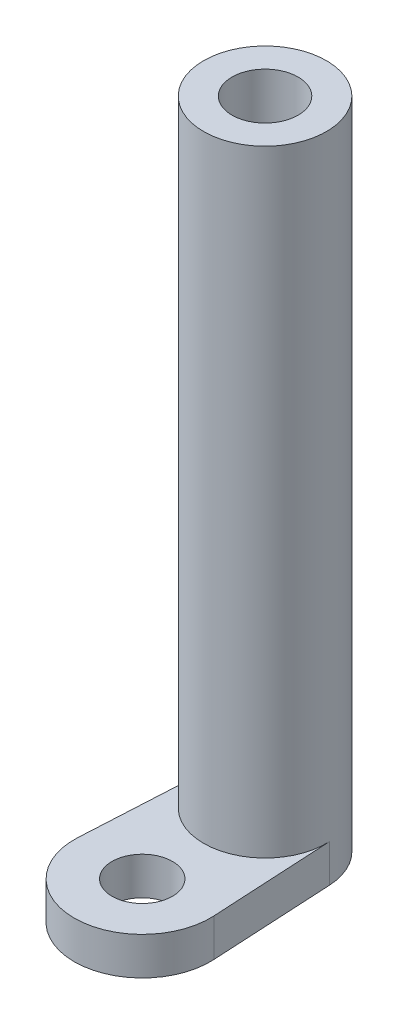
ISO-10303-21;
HEADER;
FILE_DESCRIPTION(('STEP AP214'),'2;1');
FILE_NAME('part.step','',(''),(''),'','','');
FILE_SCHEMA(('AUTOMOTIVE_DESIGN { 1 0 10303 214 1 1 1 1 }'));
ENDSEC;
DATA;
#1=APPLICATION_CONTEXT('core data for automotive mechanical design processes');
#2=APPLICATION_PROTOCOL_DEFINITION('international standard','automotive_design',2000,#1);
#3=PRODUCT_CONTEXT('',#1,'mechanical');
#4=PRODUCT('Part','Part','',(#3));
#5=PRODUCT_RELATED_PRODUCT_CATEGORY('part','',(#4));
#6=PRODUCT_DEFINITION_FORMATION('','',#4);
#7=PRODUCT_DEFINITION_CONTEXT('part definition',#1,'design');
#8=PRODUCT_DEFINITION('design','',#6,#7);
#9=PRODUCT_DEFINITION_SHAPE('','',#8);
#10=(LENGTH_UNIT() NAMED_UNIT(*) SI_UNIT(.MILLI.,.METRE.));
#11=(NAMED_UNIT(*) PLANE_ANGLE_UNIT() SI_UNIT($,.RADIAN.));
#12=(NAMED_UNIT(*) SI_UNIT($,.STERADIAN.) SOLID_ANGLE_UNIT());
#13=UNCERTAINTY_MEASURE_WITH_UNIT(LENGTH_MEASURE(1.E-05),#10,'distance_accuracy_value','');
#14=(GEOMETRIC_REPRESENTATION_CONTEXT(3) GLOBAL_UNCERTAINTY_ASSIGNED_CONTEXT((#13)) GLOBAL_UNIT_ASSIGNED_CONTEXT((#10,
#11,#12)) REPRESENTATION_CONTEXT('',''));
#15=CARTESIAN_POINT('',(0.,0.,0.));
#16=DIRECTION('',(0.,0.,1.));
#17=DIRECTION('',(1.,0.,0.));
#18=AXIS2_PLACEMENT_3D('',#15,#16,#17);
#19=CARTESIAN_POINT('',(0.,43.817388155428,0.));
#20=DIRECTION('',(0.,-1.,0.));
#21=DIRECTION('',(0.,0.,-1.));
#22=AXIS2_PLACEMENT_3D('',#19,#20,#21);
#23=CYLINDRICAL_SURFACE('',#22,3.25);
#24=CARTESIAN_POINT('',(0.,2.,0.));
#25=DIRECTION('',(0.,1.,0.));
#26=DIRECTION('',(0.,0.,1.));
#27=AXIS2_PLACEMENT_3D('',#24,#25,#26);
#28=CIRCLE('',#27,3.25);
#29=CARTESIAN_POINT('',(-3.24528504141008,2.,-0.175));
#30=VERTEX_POINT('',#29);
#31=CARTESIAN_POINT('',(3.24528504141008,2.,-0.175));
#32=VERTEX_POINT('',#31);
#33=EDGE_CURVE('E55',#30,#32,#28,.T.);
#34=ORIENTED_EDGE('',*,*,#33,.T.);
#35=DIRECTION('',(0.,-1.,0.));
#36=VECTOR('',#35,1.);
#37=CARTESIAN_POINT('',(3.24528504141008,2.,-0.175));
#38=LINE('',#37,#36);
#39=CARTESIAN_POINT('',(3.24528504141008,0.,-0.175));
#40=VERTEX_POINT('',#39);
#41=EDGE_CURVE('E86',#32,#40,#38,.T.);
#42=ORIENTED_EDGE('',*,*,#41,.T.);
#43=CARTESIAN_POINT('',(0.,0.,0.));
#44=DIRECTION('',(0.,1.,0.));
#45=DIRECTION('',(0.,0.,1.));
#46=AXIS2_PLACEMENT_3D('',#43,#44,#45);
#47=CIRCLE('',#46,3.25);
#48=CARTESIAN_POINT('',(-3.24528504141008,0.,-0.175));
#49=VERTEX_POINT('',#48);
#50=EDGE_CURVE('E47',#40,#49,#47,.T.);
#51=ORIENTED_EDGE('',*,*,#50,.T.);
#52=DIRECTION('',(0.,-1.,0.));
#53=VECTOR('',#52,1.);
#54=CARTESIAN_POINT('',(-3.24528504141008,2.,-0.175));
#55=LINE('',#54,#53);
#56=EDGE_CURVE('E60',#30,#49,#55,.T.);
#57=ORIENTED_EDGE('',*,*,#56,.F.);
#58=EDGE_LOOP('',(#34,#42,#51,#57));
#59=FACE_BOUND('',#58,.T.);
#60=CARTESIAN_POINT('',(0.,34.6250000000029,0.));
#61=DIRECTION('',(0.,1.,0.));
#62=DIRECTION('',(-1.,0.,0.));
#63=AXIS2_PLACEMENT_3D('',#60,#61,#62);
#64=CIRCLE('',#63,3.25);
#65=CARTESIAN_POINT('',(-3.25,34.6250000000029,0.));
#66=VERTEX_POINT('',#65);
#67=EDGE_CURVE('E11',#66,#66,#64,.T.);
#68=ORIENTED_EDGE('',*,*,#67,.F.);
#69=EDGE_LOOP('',(#68));
#70=FACE_BOUND('',#69,.T.);
#71=ADVANCED_FACE('F39',(#59,#70),#23,.T.);
#72=CARTESIAN_POINT('',(0.,0.,0.));
#73=DIRECTION('',(0.,1.,0.));
#74=DIRECTION('',(0.,0.,1.));
#75=AXIS2_PLACEMENT_3D('',#72,#73,#74);
#76=PLANE('',#75);
#77=ORIENTED_EDGE('',*,*,#50,.F.);
#78=DIRECTION('',(-0.0538461538461538,0.,-0.998549243510793));
#79=VECTOR('',#78,1.);
#80=CARTESIAN_POINT('',(3.59477727663885,0.,6.30615384615385));
#81=LINE('',#80,#79);
#82=CARTESIAN_POINT('',(3.59477727663885,0.,6.30615384615385));
#83=VERTEX_POINT('',#82);
#84=EDGE_CURVE('E118',#83,#40,#81,.T.);
#85=ORIENTED_EDGE('',*,*,#84,.F.);
#86=CARTESIAN_POINT('',(0.,0.,6.5));
#87=DIRECTION('',(0.,1.,0.));
#88=DIRECTION('',(0.,0.,1.));
#89=AXIS2_PLACEMENT_3D('',#86,#87,#88);
#90=CIRCLE('',#89,3.6);
#91=CARTESIAN_POINT('',(-3.59477727663885,0.,6.30615384615385));
#92=VERTEX_POINT('',#91);
#93=EDGE_CURVE('E101',#92,#83,#90,.T.);
#94=ORIENTED_EDGE('',*,*,#93,.F.);
#95=DIRECTION('',(-0.0538461538461538,0.,0.998549243510793));
#96=VECTOR('',#95,1.);
#97=CARTESIAN_POINT('',(-3.59477727663885,0.,6.30615384615385));
#98=LINE('',#97,#96);
#99=EDGE_CURVE('E97',#49,#92,#98,.T.);
#100=ORIENTED_EDGE('',*,*,#99,.F.);
#101=EDGE_LOOP('',(#77,#85,#94,#100));
#102=FACE_BOUND('',#101,.T.);
#103=CARTESIAN_POINT('',(0.,0.,0.));
#104=DIRECTION('',(0.,1.,0.));
#105=DIRECTION('',(0.,0.,1.));
#106=AXIS2_PLACEMENT_3D('',#103,#104,#105);
#107=CIRCLE('',#106,1.75);
#108=CARTESIAN_POINT('',(0.,0.,1.75));
#109=VERTEX_POINT('',#108);
#110=EDGE_CURVE('E107',#109,#109,#107,.T.);
#111=ORIENTED_EDGE('',*,*,#110,.T.);
#112=EDGE_LOOP('',(#111));
#113=FACE_BOUND('',#112,.T.);
#114=CARTESIAN_POINT('',(0.,0.,6.5));
#115=DIRECTION('',(0.,1.,0.));
#116=DIRECTION('',(0.,0.,1.));
#117=AXIS2_PLACEMENT_3D('',#114,#115,#116);
#118=CIRCLE('',#117,1.6);
#119=CARTESIAN_POINT('',(0.,0.,8.1));
#120=VERTEX_POINT('',#119);
#121=EDGE_CURVE('E126',#120,#120,#118,.T.);
#122=ORIENTED_EDGE('',*,*,#121,.T.);
#123=EDGE_LOOP('',(#122));
#124=FACE_BOUND('',#123,.T.);
#125=ADVANCED_FACE('F116',(#102,#113,#124),#76,.F.);
#126=CARTESIAN_POINT('',(0.,43.817388155428,0.));
#127=DIRECTION('',(0.,-1.,0.));
#128=DIRECTION('',(0.,0.,-1.));
#129=AXIS2_PLACEMENT_3D('',#126,#127,#128);
#130=CYLINDRICAL_SURFACE('',#129,1.75);
#131=CARTESIAN_POINT('',(0.,34.6250000000029,0.));
#132=DIRECTION('',(0.,1.,0.));
#133=DIRECTION('',(-1.,0.,0.));
#134=AXIS2_PLACEMENT_3D('',#131,#132,#133);
#135=CIRCLE('',#134,1.75);
#136=CARTESIAN_POINT('',(-1.75,34.6250000000029,0.));
#137=VERTEX_POINT('',#136);
#138=EDGE_CURVE('E42',#137,#137,#135,.T.);
#139=ORIENTED_EDGE('',*,*,#138,.T.);
#140=EDGE_LOOP('',(#139));
#141=FACE_BOUND('',#140,.T.);
#142=ORIENTED_EDGE('',*,*,#110,.F.);
#143=EDGE_LOOP('',(#142));
#144=FACE_BOUND('',#143,.T.);
#145=ADVANCED_FACE('F148',(#141,#144),#130,.F.);
#146=CARTESIAN_POINT('',(0.,34.6250000000029,37.5));
#147=DIRECTION('',(0.,1.,0.));
#148=DIRECTION('',(0.707106781186549,0.,-0.707106781186546));
#149=AXIS2_PLACEMENT_3D('',#146,#147,#148);
#150=PLANE('',#149);
#151=ORIENTED_EDGE('',*,*,#138,.F.);
#152=EDGE_LOOP('',(#151));
#153=FACE_BOUND('',#152,.T.);
#154=ORIENTED_EDGE('',*,*,#67,.T.);
#155=EDGE_LOOP('',(#154));
#156=FACE_BOUND('',#155,.T.);
#157=ADVANCED_FACE('F152',(#153,#156),#150,.T.);
#158=CARTESIAN_POINT('',(0.,2.,6.5));
#159=DIRECTION('',(0.,1.,0.));
#160=DIRECTION('',(0.,0.,1.));
#161=AXIS2_PLACEMENT_3D('',#158,#159,#160);
#162=PLANE('',#161);
#163=CARTESIAN_POINT('',(0.,2.,6.5));
#164=DIRECTION('',(0.,1.,0.));
#165=DIRECTION('',(0.,0.,1.));
#166=AXIS2_PLACEMENT_3D('',#163,#164,#165);
#167=CIRCLE('',#166,1.6);
#168=CARTESIAN_POINT('',(0.,2.,8.1));
#169=VERTEX_POINT('',#168);
#170=EDGE_CURVE('E124',#169,#169,#167,.T.);
#171=ORIENTED_EDGE('',*,*,#170,.F.);
#172=EDGE_LOOP('',(#171));
#173=FACE_BOUND('',#172,.T.);
#174=ORIENTED_EDGE('',*,*,#33,.F.);
#175=DIRECTION('',(-0.0538461538461538,0.,0.998549243510793));
#176=VECTOR('',#175,1.);
#177=CARTESIAN_POINT('',(-3.59477727663885,2.,6.30615384615385));
#178=LINE('',#177,#176);
#179=CARTESIAN_POINT('',(-3.59477727663885,2.,6.30615384615385));
#180=VERTEX_POINT('',#179);
#181=EDGE_CURVE('E88',#30,#180,#178,.T.);
#182=ORIENTED_EDGE('',*,*,#181,.T.);
#183=CARTESIAN_POINT('',(0.,2.,6.5));
#184=DIRECTION('',(0.,1.,0.));
#185=DIRECTION('',(0.,0.,1.));
#186=AXIS2_PLACEMENT_3D('',#183,#184,#185);
#187=CIRCLE('',#186,3.6);
#188=CARTESIAN_POINT('',(3.59477727663885,2.,6.30615384615385));
#189=VERTEX_POINT('',#188);
#190=EDGE_CURVE('E89',#180,#189,#187,.T.);
#191=ORIENTED_EDGE('',*,*,#190,.T.);
#192=DIRECTION('',(-0.0538461538461538,0.,-0.998549243510793));
#193=VECTOR('',#192,1.);
#194=CARTESIAN_POINT('',(3.59477727663885,2.,6.30615384615385));
#195=LINE('',#194,#193);
#196=EDGE_CURVE('E79',#189,#32,#195,.T.);
#197=ORIENTED_EDGE('',*,*,#196,.T.);
#198=EDGE_LOOP('',(#174,#182,#191,#197));
#199=FACE_BOUND('',#198,.T.);
#200=ADVANCED_FACE('F92',(#173,#199),#162,.T.);
#201=CARTESIAN_POINT('',(0.,2.,6.5));
#202=DIRECTION('',(0.,-1.,0.));
#203=DIRECTION('',(0.,0.,-1.));
#204=AXIS2_PLACEMENT_3D('',#201,#202,#203);
#205=CYLINDRICAL_SURFACE('',#204,3.6);
#206=ORIENTED_EDGE('',*,*,#93,.T.);
#207=DIRECTION('',(0.,-1.,0.));
#208=VECTOR('',#207,1.);
#209=CARTESIAN_POINT('',(3.59477727663885,2.,6.30615384615385));
#210=LINE('',#209,#208);
#211=EDGE_CURVE('E84',#189,#83,#210,.T.);
#212=ORIENTED_EDGE('',*,*,#211,.F.);
#213=ORIENTED_EDGE('',*,*,#190,.F.);
#214=DIRECTION('',(0.,-1.,0.));
#215=VECTOR('',#214,1.);
#216=CARTESIAN_POINT('',(-3.59477727663885,2.,6.30615384615385));
#217=LINE('',#216,#215);
#218=EDGE_CURVE('E115',#180,#92,#217,.T.);
#219=ORIENTED_EDGE('',*,*,#218,.T.);
#220=EDGE_LOOP('',(#206,#212,#213,#219));
#221=FACE_BOUND('',#220,.T.);
#222=ADVANCED_FACE('F99',(#221),#205,.T.);
#223=CARTESIAN_POINT('',(3.59477727663885,2.,6.30615384615385));
#224=DIRECTION('',(-0.998549243510793,0.,0.0538461538461538));
#225=DIRECTION('',(0.0538461538461538,0.,0.998549243510793));
#226=AXIS2_PLACEMENT_3D('',#223,#224,#225);
#227=PLANE('',#226);
#228=ORIENTED_EDGE('',*,*,#84,.T.);
#229=ORIENTED_EDGE('',*,*,#41,.F.);
#230=ORIENTED_EDGE('',*,*,#196,.F.);
#231=ORIENTED_EDGE('',*,*,#211,.T.);
#232=EDGE_LOOP('',(#228,#229,#230,#231));
#233=FACE_BOUND('',#232,.T.);
#234=ADVANCED_FACE('F82',(#233),#227,.F.);
#235=CARTESIAN_POINT('',(-3.59477727663885,2.,6.30615384615385));
#236=DIRECTION('',(0.998549243510793,0.,0.0538461538461538));
#237=DIRECTION('',(0.0538461538461538,0.,-0.998549243510793));
#238=AXIS2_PLACEMENT_3D('',#235,#236,#237);
#239=PLANE('',#238);
#240=ORIENTED_EDGE('',*,*,#99,.T.);
#241=ORIENTED_EDGE('',*,*,#218,.F.);
#242=ORIENTED_EDGE('',*,*,#181,.F.);
#243=ORIENTED_EDGE('',*,*,#56,.T.);
#244=EDGE_LOOP('',(#240,#241,#242,#243));
#245=FACE_BOUND('',#244,.T.);
#246=ADVANCED_FACE('F114',(#245),#239,.F.);
#247=CARTESIAN_POINT('',(0.,2.,6.5));
#248=DIRECTION('',(0.,-1.,0.));
#249=DIRECTION('',(0.,0.,-1.));
#250=AXIS2_PLACEMENT_3D('',#247,#248,#249);
#251=CYLINDRICAL_SURFACE('',#250,1.6);
#252=ORIENTED_EDGE('',*,*,#170,.T.);
#253=EDGE_LOOP('',(#252));
#254=FACE_BOUND('',#253,.T.);
#255=ORIENTED_EDGE('',*,*,#121,.F.);
#256=EDGE_LOOP('',(#255));
#257=FACE_BOUND('',#256,.T.);
#258=ADVANCED_FACE('F135',(#254,#257),#251,.F.);
#259=CLOSED_SHELL('',(#71,#125,#145,#157,#200,#222,#234,#246,#258));
#260=MANIFOLD_SOLID_BREP('B2',#259);
#261=ADVANCED_BREP_SHAPE_REPRESENTATION('',(#18,#260),#14);
#262=SHAPE_DEFINITION_REPRESENTATION(#9,#261);
ENDSEC;
END-ISO-10303-21;
